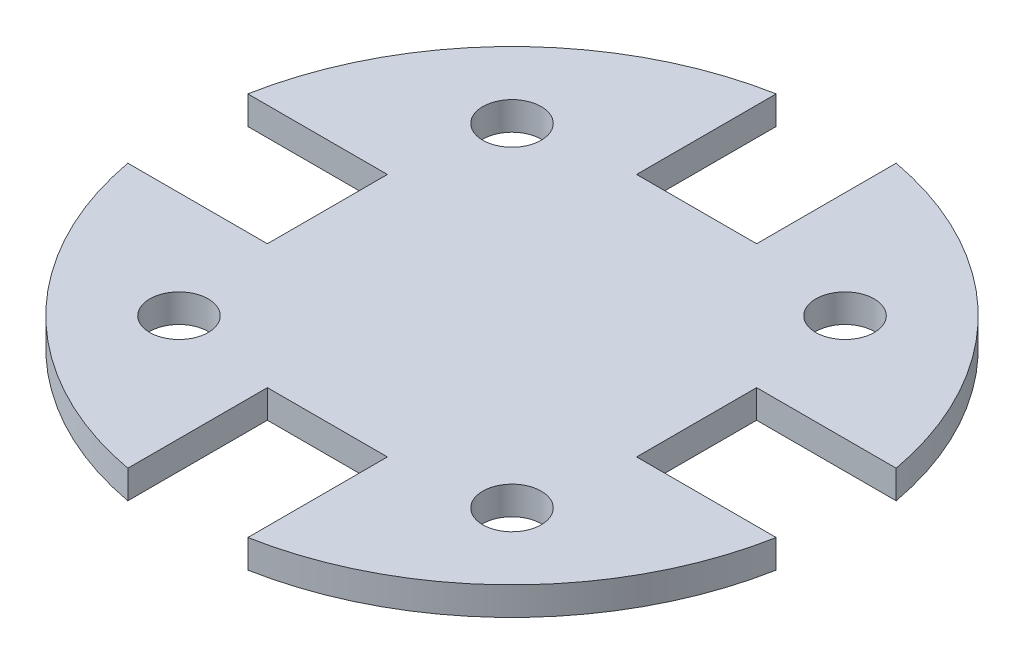
ISO-10303-21;
HEADER;
FILE_DESCRIPTION(('STEP AP214'),'2;1');
FILE_NAME('part.step','',(''),(''),'','','');
FILE_SCHEMA(('AUTOMOTIVE_DESIGN { 1 0 10303 214 1 1 1 1 }'));
ENDSEC;
DATA;
#1=APPLICATION_CONTEXT('core data for automotive mechanical design processes');
#2=APPLICATION_PROTOCOL_DEFINITION('international standard','automotive_design',2000,#1);
#3=PRODUCT_CONTEXT('',#1,'mechanical');
#4=PRODUCT('Part','Part','',(#3));
#5=PRODUCT_RELATED_PRODUCT_CATEGORY('part','',(#4));
#6=PRODUCT_DEFINITION_FORMATION('','',#4);
#7=PRODUCT_DEFINITION_CONTEXT('part definition',#1,'design');
#8=PRODUCT_DEFINITION('design','',#6,#7);
#9=PRODUCT_DEFINITION_SHAPE('','',#8);
#10=(LENGTH_UNIT() NAMED_UNIT(*) SI_UNIT(.MILLI.,.METRE.));
#11=(NAMED_UNIT(*) PLANE_ANGLE_UNIT() SI_UNIT($,.RADIAN.));
#12=(NAMED_UNIT(*) SI_UNIT($,.STERADIAN.) SOLID_ANGLE_UNIT());
#13=UNCERTAINTY_MEASURE_WITH_UNIT(LENGTH_MEASURE(1.E-05),#10,'distance_accuracy_value','');
#14=(GEOMETRIC_REPRESENTATION_CONTEXT(3) GLOBAL_UNCERTAINTY_ASSIGNED_CONTEXT((#13)) GLOBAL_UNIT_ASSIGNED_CONTEXT((#10,
#11,#12)) REPRESENTATION_CONTEXT('',''));
#15=CARTESIAN_POINT('',(0.,0.,0.));
#16=DIRECTION('',(0.,0.,1.));
#17=DIRECTION('',(1.,0.,0.));
#18=AXIS2_PLACEMENT_3D('',#15,#16,#17);
#19=CARTESIAN_POINT('',(0.,5.,0.));
#20=DIRECTION('',(0.,-1.,0.));
#21=DIRECTION('',(0.,0.,-1.));
#22=AXIS2_PLACEMENT_3D('',#19,#20,#21);
#23=CYLINDRICAL_SURFACE('',#22,35.);
#24=DIRECTION('',(0.,-1.,0.));
#25=VECTOR('',#24,1.);
#26=CARTESIAN_POINT('',(-6.37000000000012,5.,-34.4154485660146));
#27=LINE('',#26,#25);
#28=CARTESIAN_POINT('',(-6.37000000000012,5.,-34.4154485660146));
#29=VERTEX_POINT('',#28);
#30=CARTESIAN_POINT('',(-6.37000000000014,2.,-34.4154485660146));
#31=VERTEX_POINT('',#30);
#32=EDGE_CURVE('E167',#29,#31,#27,.T.);
#33=ORIENTED_EDGE('',*,*,#32,.T.);
#34=CARTESIAN_POINT('',(0.,2.,0.));
#35=DIRECTION('',(0.,1.,0.));
#36=DIRECTION('',(0.,0.,1.));
#37=AXIS2_PLACEMENT_3D('',#34,#35,#36);
#38=CIRCLE('',#37,35.);
#39=CARTESIAN_POINT('',(-34.4154485660147,2.,-6.36999999999965));
#40=VERTEX_POINT('',#39);
#41=EDGE_CURVE('E153',#40,#31,#38,.F.);
#42=ORIENTED_EDGE('',*,*,#41,.F.);
#43=DIRECTION('',(0.,-1.,0.));
#44=VECTOR('',#43,1.);
#45=CARTESIAN_POINT('',(-34.4154485660147,5.,-6.36999999999965));
#46=LINE('',#45,#44);
#47=CARTESIAN_POINT('',(-34.4154485660147,5.,-6.36999999999965));
#48=VERTEX_POINT('',#47);
#49=EDGE_CURVE('E164',#40,#48,#46,.F.);
#50=ORIENTED_EDGE('',*,*,#49,.T.);
#51=CARTESIAN_POINT('',(0.,5.,0.));
#52=DIRECTION('',(0.,1.,0.));
#53=DIRECTION('',(0.,0.,1.));
#54=AXIS2_PLACEMENT_3D('',#51,#52,#53);
#55=CIRCLE('',#54,35.);
#56=EDGE_CURVE('E12',#29,#48,#55,.T.);
#57=ORIENTED_EDGE('',*,*,#56,.F.);
#58=EDGE_LOOP('',(#33,#42,#50,#57));
#59=FACE_BOUND('',#58,.T.);
#60=ADVANCED_FACE('F35',(#59),#23,.T.);
#61=DIRECTION('',(0.,-1.,0.));
#62=VECTOR('',#61,1.);
#63=CARTESIAN_POINT('',(-34.4154485660146,5.,6.37000000000024));
#64=LINE('',#63,#62);
#65=CARTESIAN_POINT('',(-34.4154485660146,5.,6.37000000000024));
#66=VERTEX_POINT('',#65);
#67=CARTESIAN_POINT('',(-34.4154485660146,2.,6.37000000000024));
#68=VERTEX_POINT('',#67);
#69=EDGE_CURVE('E174',#66,#68,#64,.T.);
#70=ORIENTED_EDGE('',*,*,#69,.T.);
#71=CARTESIAN_POINT('',(0.,2.,0.));
#72=DIRECTION('',(0.,1.,0.));
#73=DIRECTION('',(0.,0.,1.));
#74=AXIS2_PLACEMENT_3D('',#71,#72,#73);
#75=CIRCLE('',#74,35.);
#76=CARTESIAN_POINT('',(-6.36999999999977,2.,34.4154485660147));
#77=VERTEX_POINT('',#76);
#78=EDGE_CURVE('E51',#77,#68,#75,.F.);
#79=ORIENTED_EDGE('',*,*,#78,.F.);
#80=DIRECTION('',(0.,-1.,0.));
#81=VECTOR('',#80,1.);
#82=CARTESIAN_POINT('',(-6.36999999999977,5.,34.4154485660147));
#83=LINE('',#82,#81);
#84=CARTESIAN_POINT('',(-6.36999999999977,5.,34.4154485660147));
#85=VERTEX_POINT('',#84);
#86=EDGE_CURVE('E177',#77,#85,#83,.F.);
#87=ORIENTED_EDGE('',*,*,#86,.T.);
#88=EDGE_CURVE('E43',#66,#85,#55,.T.);
#89=ORIENTED_EDGE('',*,*,#88,.F.);
#90=EDGE_LOOP('',(#70,#79,#87,#89));
#91=FACE_BOUND('',#90,.T.);
#92=ADVANCED_FACE('F269',(#91),#23,.T.);
#93=DIRECTION('',(0.,-1.,0.));
#94=VECTOR('',#93,1.);
#95=CARTESIAN_POINT('',(6.37000000000012,5.,34.4154485660146));
#96=LINE('',#95,#94);
#97=CARTESIAN_POINT('',(6.37000000000012,5.,34.4154485660146));
#98=VERTEX_POINT('',#97);
#99=CARTESIAN_POINT('',(6.37000000000012,2.,34.4154485660146));
#100=VERTEX_POINT('',#99);
#101=EDGE_CURVE('E173',#98,#100,#96,.T.);
#102=ORIENTED_EDGE('',*,*,#101,.T.);
#103=CARTESIAN_POINT('',(0.,2.,0.));
#104=DIRECTION('',(0.,1.,0.));
#105=DIRECTION('',(0.,0.,1.));
#106=AXIS2_PLACEMENT_3D('',#103,#104,#105);
#107=CIRCLE('',#106,35.);
#108=CARTESIAN_POINT('',(34.4154485660148,2.,6.36999999999941));
#109=VERTEX_POINT('',#108);
#110=EDGE_CURVE('E289',#109,#100,#107,.F.);
#111=ORIENTED_EDGE('',*,*,#110,.F.);
#112=DIRECTION('',(0.,-1.,0.));
#113=VECTOR('',#112,1.);
#114=CARTESIAN_POINT('',(34.4154485660148,5.,6.36999999999941));
#115=LINE('',#114,#113);
#116=CARTESIAN_POINT('',(34.4154485660148,5.,6.36999999999941));
#117=VERTEX_POINT('',#116);
#118=EDGE_CURVE('E188',#109,#117,#115,.F.);
#119=ORIENTED_EDGE('',*,*,#118,.T.);
#120=EDGE_CURVE('E253',#98,#117,#55,.T.);
#121=ORIENTED_EDGE('',*,*,#120,.F.);
#122=EDGE_LOOP('',(#102,#111,#119,#121));
#123=FACE_BOUND('',#122,.T.);
#124=ADVANCED_FACE('F287',(#123),#23,.T.);
#125=DIRECTION('',(0.,-1.,0.));
#126=VECTOR('',#125,1.);
#127=CARTESIAN_POINT('',(34.4154485660146,5.,-6.37000000000048));
#128=LINE('',#127,#126);
#129=CARTESIAN_POINT('',(34.4154485660146,5.,-6.37000000000048));
#130=VERTEX_POINT('',#129);
#131=CARTESIAN_POINT('',(34.4154485660146,2.,-6.37000000000048));
#132=VERTEX_POINT('',#131);
#133=EDGE_CURVE('E185',#130,#132,#128,.T.);
#134=ORIENTED_EDGE('',*,*,#133,.T.);
#135=CARTESIAN_POINT('',(0.,2.,0.));
#136=DIRECTION('',(0.,1.,0.));
#137=DIRECTION('',(0.,0.,1.));
#138=AXIS2_PLACEMENT_3D('',#135,#136,#137);
#139=CIRCLE('',#138,35.);
#140=CARTESIAN_POINT('',(6.36999999999977,2.,-34.4154485660147));
#141=VERTEX_POINT('',#140);
#142=EDGE_CURVE('E308',#141,#132,#139,.F.);
#143=ORIENTED_EDGE('',*,*,#142,.F.);
#144=DIRECTION('',(0.,-1.,0.));
#145=VECTOR('',#144,1.);
#146=CARTESIAN_POINT('',(6.36999999999977,5.,-34.4154485660147));
#147=LINE('',#146,#145);
#148=CARTESIAN_POINT('',(6.36999999999977,5.,-34.4154485660147));
#149=VERTEX_POINT('',#148);
#150=EDGE_CURVE('E191',#141,#149,#147,.F.);
#151=ORIENTED_EDGE('',*,*,#150,.T.);
#152=EDGE_CURVE('E44',#130,#149,#55,.T.);
#153=ORIENTED_EDGE('',*,*,#152,.F.);
#154=EDGE_LOOP('',(#134,#143,#151,#153));
#155=FACE_BOUND('',#154,.T.);
#156=ADVANCED_FACE('F37',(#155),#23,.T.);
#157=CARTESIAN_POINT('',(0.,5.,0.));
#158=DIRECTION('',(0.,1.,0.));
#159=DIRECTION('',(0.,0.,1.));
#160=AXIS2_PLACEMENT_3D('',#157,#158,#159);
#161=PLANE('',#160);
#162=ORIENTED_EDGE('',*,*,#56,.T.);
#163=DIRECTION('',(-1.,0.,0.));
#164=VECTOR('',#163,1.);
#165=CARTESIAN_POINT('',(-19.6,5.,-6.3699999999997));
#166=LINE('',#165,#164);
#167=CARTESIAN_POINT('',(-19.6,5.,-6.3699999999997));
#168=VERTEX_POINT('',#167);
#169=EDGE_CURVE('E172',#168,#48,#166,.T.);
#170=ORIENTED_EDGE('',*,*,#169,.F.);
#171=DIRECTION('',(0.,0.,-1.));
#172=VECTOR('',#171,1.);
#173=CARTESIAN_POINT('',(-19.5999999999999,5.,6.37000000000019));
#174=LINE('',#173,#172);
#175=CARTESIAN_POINT('',(-19.5999999999999,5.,6.37000000000019));
#176=VERTEX_POINT('',#175);
#177=EDGE_CURVE('E199',#176,#168,#174,.T.);
#178=ORIENTED_EDGE('',*,*,#177,.F.);
#179=DIRECTION('',(1.,0.,0.));
#180=VECTOR('',#179,1.);
#181=CARTESIAN_POINT('',(-19.5999999999999,5.,6.37000000000019));
#182=LINE('',#181,#180);
#183=EDGE_CURVE('E195',#66,#176,#182,.T.);
#184=ORIENTED_EDGE('',*,*,#183,.F.);
#185=ORIENTED_EDGE('',*,*,#88,.T.);
#186=DIRECTION('',(0.,0.,1.));
#187=VECTOR('',#186,1.);
#188=CARTESIAN_POINT('',(-6.36999999999977,5.,19.5999999999999));
#189=LINE('',#188,#187);
#190=CARTESIAN_POINT('',(-6.36999999999977,5.,19.5999999999999));
#191=VERTEX_POINT('',#190);
#192=EDGE_CURVE('E207',#191,#85,#189,.T.);
#193=ORIENTED_EDGE('',*,*,#192,.F.);
#194=DIRECTION('',(-1.,0.,0.));
#195=VECTOR('',#194,1.);
#196=CARTESIAN_POINT('',(6.37000000000012,5.,19.5999999999999));
#197=LINE('',#196,#195);
#198=CARTESIAN_POINT('',(6.37000000000012,5.,19.5999999999999));
#199=VERTEX_POINT('',#198);
#200=EDGE_CURVE('E214',#199,#191,#197,.T.);
#201=ORIENTED_EDGE('',*,*,#200,.F.);
#202=DIRECTION('',(0.,0.,-1.));
#203=VECTOR('',#202,1.);
#204=CARTESIAN_POINT('',(6.37000000000012,5.,19.5999999999999));
#205=LINE('',#204,#203);
#206=EDGE_CURVE('E210',#98,#199,#205,.T.);
#207=ORIENTED_EDGE('',*,*,#206,.F.);
#208=ORIENTED_EDGE('',*,*,#120,.T.);
#209=DIRECTION('',(1.,0.,0.));
#210=VECTOR('',#209,1.);
#211=CARTESIAN_POINT('',(19.6,5.,6.36999999999956));
#212=LINE('',#211,#210);
#213=CARTESIAN_POINT('',(19.6,5.,6.36999999999956));
#214=VERTEX_POINT('',#213);
#215=EDGE_CURVE('E193',#214,#117,#212,.T.);
#216=ORIENTED_EDGE('',*,*,#215,.F.);
#217=DIRECTION('',(0.,0.,1.));
#218=VECTOR('',#217,1.);
#219=CARTESIAN_POINT('',(19.5999999999999,5.,-6.37000000000033));
#220=LINE('',#219,#218);
#221=CARTESIAN_POINT('',(19.5999999999999,5.,-6.37000000000033));
#222=VERTEX_POINT('',#221);
#223=EDGE_CURVE('E225',#222,#214,#220,.T.);
#224=ORIENTED_EDGE('',*,*,#223,.F.);
#225=DIRECTION('',(-1.,0.,0.));
#226=VECTOR('',#225,1.);
#227=CARTESIAN_POINT('',(19.5999999999999,5.,-6.37000000000033));
#228=LINE('',#227,#226);
#229=EDGE_CURVE('E222',#130,#222,#228,.T.);
#230=ORIENTED_EDGE('',*,*,#229,.F.);
#231=ORIENTED_EDGE('',*,*,#152,.T.);
#232=DIRECTION('',(0.,0.,-1.));
#233=VECTOR('',#232,1.);
#234=CARTESIAN_POINT('',(6.36999999999977,5.,-19.5999999999999));
#235=LINE('',#234,#233);
#236=CARTESIAN_POINT('',(6.36999999999977,5.,-19.5999999999999));
#237=VERTEX_POINT('',#236);
#238=EDGE_CURVE('E205',#237,#149,#235,.T.);
#239=ORIENTED_EDGE('',*,*,#238,.F.);
#240=DIRECTION('',(1.,0.,0.));
#241=VECTOR('',#240,1.);
#242=CARTESIAN_POINT('',(-6.37000000000012,5.,-19.5999999999999));
#243=LINE('',#242,#241);
#244=CARTESIAN_POINT('',(-6.37000000000012,5.,-19.5999999999999));
#245=VERTEX_POINT('',#244);
#246=EDGE_CURVE('E235',#245,#237,#243,.T.);
#247=ORIENTED_EDGE('',*,*,#246,.F.);
#248=DIRECTION('',(0.,0.,1.));
#249=VECTOR('',#248,1.);
#250=CARTESIAN_POINT('',(-6.37000000000012,5.,-19.5999999999999));
#251=LINE('',#250,#249);
#252=EDGE_CURVE('E232',#29,#245,#251,.T.);
#253=ORIENTED_EDGE('',*,*,#252,.F.);
#254=EDGE_LOOP('',(#162,#170,#178,#184,#185,#193,#201,#207,#208,#216,#224,#230,#231,#239,#247,#253));
#255=FACE_BOUND('',#254,.T.);
#256=CARTESIAN_POINT('',(-17.6776695296637,5.,17.6776695296638));
#257=DIRECTION('',(0.,1.,0.));
#258=DIRECTION('',(0.,0.,1.));
#259=AXIS2_PLACEMENT_3D('',#256,#257,#258);
#260=CIRCLE('',#259,3.1);
#261=CARTESIAN_POINT('',(-17.6776695296637,5.,20.7776695296638));
#262=VERTEX_POINT('',#261);
#263=EDGE_CURVE('E239',#262,#262,#260,.T.);
#264=ORIENTED_EDGE('',*,*,#263,.F.);
#265=EDGE_LOOP('',(#264));
#266=FACE_BOUND('',#265,.T.);
#267=CARTESIAN_POINT('',(17.6776695296637,5.,17.6776695296638));
#268=DIRECTION('',(0.,1.,0.));
#269=DIRECTION('',(0.,0.,1.));
#270=AXIS2_PLACEMENT_3D('',#267,#268,#269);
#271=CIRCLE('',#270,3.1);
#272=CARTESIAN_POINT('',(17.6776695296637,5.,20.7776695296638));
#273=VERTEX_POINT('',#272);
#274=EDGE_CURVE('E245',#273,#273,#271,.T.);
#275=ORIENTED_EDGE('',*,*,#274,.F.);
#276=EDGE_LOOP('',(#275));
#277=FACE_BOUND('',#276,.T.);
#278=CARTESIAN_POINT('',(17.6776695296637,5.,-17.6776695296636));
#279=DIRECTION('',(0.,1.,0.));
#280=DIRECTION('',(0.,0.,1.));
#281=AXIS2_PLACEMENT_3D('',#278,#279,#280);
#282=CIRCLE('',#281,3.1);
#283=CARTESIAN_POINT('',(17.6776695296637,5.,-14.5776695296636));
#284=VERTEX_POINT('',#283);
#285=EDGE_CURVE('E241',#284,#284,#282,.T.);
#286=ORIENTED_EDGE('',*,*,#285,.F.);
#287=EDGE_LOOP('',(#286));
#288=FACE_BOUND('',#287,.T.);
#289=CARTESIAN_POINT('',(-17.6776695296637,5.,-17.6776695296636));
#290=DIRECTION('',(0.,1.,0.));
#291=DIRECTION('',(0.,0.,1.));
#292=AXIS2_PLACEMENT_3D('',#289,#290,#291);
#293=CIRCLE('',#292,3.1);
#294=CARTESIAN_POINT('',(-17.6776695296637,5.,-14.5776695296636));
#295=VERTEX_POINT('',#294);
#296=EDGE_CURVE('E244',#295,#295,#293,.T.);
#297=ORIENTED_EDGE('',*,*,#296,.F.);
#298=EDGE_LOOP('',(#297));
#299=FACE_BOUND('',#298,.T.);
#300=ADVANCED_FACE('F263',(#255,#266,#277,#288,#299),#161,.T.);
#301=CARTESIAN_POINT('',(-17.6776695296637,0.,-17.6776695296636));
#302=DIRECTION('',(0.,1.,0.));
#303=DIRECTION('',(0.,0.,1.));
#304=AXIS2_PLACEMENT_3D('',#301,#302,#303);
#305=CYLINDRICAL_SURFACE('',#304,3.1);
#306=CARTESIAN_POINT('',(-17.6776695296637,2.,-17.6776695296636));
#307=DIRECTION('',(0.,1.,0.));
#308=DIRECTION('',(0.,0.,1.));
#309=AXIS2_PLACEMENT_3D('',#306,#307,#308);
#310=CIRCLE('',#309,3.1);
#311=CARTESIAN_POINT('',(-17.6776695296637,2.,-14.5776695296636));
#312=VERTEX_POINT('',#311);
#313=EDGE_CURVE('E180',#312,#312,#310,.F.);
#314=ORIENTED_EDGE('',*,*,#313,.T.);
#315=EDGE_LOOP('',(#314));
#316=FACE_BOUND('',#315,.T.);
#317=ORIENTED_EDGE('',*,*,#296,.T.);
#318=EDGE_LOOP('',(#317));
#319=FACE_BOUND('',#318,.T.);
#320=ADVANCED_FACE('F353',(#316,#319),#305,.F.);
#321=CARTESIAN_POINT('',(17.6776695296637,0.,-17.6776695296636));
#322=DIRECTION('',(0.,1.,0.));
#323=DIRECTION('',(0.,0.,1.));
#324=AXIS2_PLACEMENT_3D('',#321,#322,#323);
#325=CYLINDRICAL_SURFACE('',#324,3.1);
#326=CARTESIAN_POINT('',(17.6776695296637,2.,-17.6776695296636));
#327=DIRECTION('',(0.,1.,0.));
#328=DIRECTION('',(0.,0.,1.));
#329=AXIS2_PLACEMENT_3D('',#326,#327,#328);
#330=CIRCLE('',#329,3.1);
#331=CARTESIAN_POINT('',(17.6776695296637,2.,-14.5776695296636));
#332=VERTEX_POINT('',#331);
#333=EDGE_CURVE('E348',#332,#332,#330,.F.);
#334=ORIENTED_EDGE('',*,*,#333,.T.);
#335=EDGE_LOOP('',(#334));
#336=FACE_BOUND('',#335,.T.);
#337=ORIENTED_EDGE('',*,*,#285,.T.);
#338=EDGE_LOOP('',(#337));
#339=FACE_BOUND('',#338,.T.);
#340=ADVANCED_FACE('F401',(#336,#339),#325,.F.);
#341=CARTESIAN_POINT('',(17.6776695296637,0.,17.6776695296638));
#342=DIRECTION('',(0.,1.,0.));
#343=DIRECTION('',(0.,0.,1.));
#344=AXIS2_PLACEMENT_3D('',#341,#342,#343);
#345=CYLINDRICAL_SURFACE('',#344,3.1);
#346=CARTESIAN_POINT('',(17.6776695296637,2.,17.6776695296638));
#347=DIRECTION('',(0.,1.,0.));
#348=DIRECTION('',(0.,0.,1.));
#349=AXIS2_PLACEMENT_3D('',#346,#347,#348);
#350=CIRCLE('',#349,3.1);
#351=CARTESIAN_POINT('',(17.6776695296637,2.,20.7776695296638));
#352=VERTEX_POINT('',#351);
#353=EDGE_CURVE('E345',#352,#352,#350,.F.);
#354=ORIENTED_EDGE('',*,*,#353,.T.);
#355=EDGE_LOOP('',(#354));
#356=FACE_BOUND('',#355,.T.);
#357=ORIENTED_EDGE('',*,*,#274,.T.);
#358=EDGE_LOOP('',(#357));
#359=FACE_BOUND('',#358,.T.);
#360=ADVANCED_FACE('F407',(#356,#359),#345,.F.);
#361=CARTESIAN_POINT('',(-17.6776695296637,0.,17.6776695296638));
#362=DIRECTION('',(0.,1.,0.));
#363=DIRECTION('',(0.,0.,1.));
#364=AXIS2_PLACEMENT_3D('',#361,#362,#363);
#365=CYLINDRICAL_SURFACE('',#364,3.1);
#366=CARTESIAN_POINT('',(-17.6776695296637,2.,17.6776695296638));
#367=DIRECTION('',(0.,1.,0.));
#368=DIRECTION('',(0.,0.,1.));
#369=AXIS2_PLACEMENT_3D('',#366,#367,#368);
#370=CIRCLE('',#369,3.1);
#371=CARTESIAN_POINT('',(-17.6776695296637,2.,20.7776695296638));
#372=VERTEX_POINT('',#371);
#373=EDGE_CURVE('E326',#372,#372,#370,.F.);
#374=ORIENTED_EDGE('',*,*,#373,.T.);
#375=EDGE_LOOP('',(#374));
#376=FACE_BOUND('',#375,.T.);
#377=ORIENTED_EDGE('',*,*,#263,.T.);
#378=EDGE_LOOP('',(#377));
#379=FACE_BOUND('',#378,.T.);
#380=ADVANCED_FACE('F415',(#376,#379),#365,.F.);
#381=CARTESIAN_POINT('',(6.36999999999977,1.15359111152458E-13,-19.5999999999999));
#382=DIRECTION('',(1.,0.,0.));
#383=DIRECTION('',(0.,0.,-1.));
#384=AXIS2_PLACEMENT_3D('',#381,#382,#383);
#385=PLANE('',#384);
#386=ORIENTED_EDGE('',*,*,#150,.F.);
#387=DIRECTION('',(0.,0.,-1.));
#388=VECTOR('',#387,1.);
#389=CARTESIAN_POINT('',(6.36999999999977,2.,-19.5999999999999));
#390=LINE('',#389,#388);
#391=CARTESIAN_POINT('',(6.36999999999977,2.,-19.5999999999999));
#392=VERTEX_POINT('',#391);
#393=EDGE_CURVE('E310',#392,#141,#390,.T.);
#394=ORIENTED_EDGE('',*,*,#393,.F.);
#395=DIRECTION('',(0.,1.,0.));
#396=VECTOR('',#395,1.);
#397=CARTESIAN_POINT('',(6.36999999999977,1.15359111152458E-13,-19.5999999999999));
#398=LINE('',#397,#396);
#399=EDGE_CURVE('E59',#392,#237,#398,.T.);
#400=ORIENTED_EDGE('',*,*,#399,.T.);
#401=ORIENTED_EDGE('',*,*,#238,.T.);
#402=EDGE_LOOP('',(#386,#394,#400,#401));
#403=FACE_BOUND('',#402,.T.);
#404=ADVANCED_FACE('F309',(#403),#385,.F.);
#405=CARTESIAN_POINT('',(-6.37000000000012,1.15359111152458E-13,-19.5999999999999));
#406=DIRECTION('',(0.,0.,1.));
#407=DIRECTION('',(1.,0.,0.));
#408=AXIS2_PLACEMENT_3D('',#405,#406,#407);
#409=PLANE('',#408);
#410=ORIENTED_EDGE('',*,*,#399,.F.);
#411=DIRECTION('',(1.,0.,0.));
#412=VECTOR('',#411,1.);
#413=CARTESIAN_POINT('',(-6.37000000000012,2.,-19.5999999999999));
#414=LINE('',#413,#412);
#415=CARTESIAN_POINT('',(-6.37000000000012,2.,-19.5999999999999));
#416=VERTEX_POINT('',#415);
#417=EDGE_CURVE('E316',#416,#392,#414,.T.);
#418=ORIENTED_EDGE('',*,*,#417,.F.);
#419=DIRECTION('',(0.,1.,0.));
#420=VECTOR('',#419,1.);
#421=CARTESIAN_POINT('',(-6.37000000000012,1.15359111152458E-13,-19.5999999999999));
#422=LINE('',#421,#420);
#423=EDGE_CURVE('E237',#416,#245,#422,.T.);
#424=ORIENTED_EDGE('',*,*,#423,.T.);
#425=ORIENTED_EDGE('',*,*,#246,.T.);
#426=EDGE_LOOP('',(#410,#418,#424,#425));
#427=FACE_BOUND('',#426,.T.);
#428=ADVANCED_FACE('F313',(#427),#409,.F.);
#429=CARTESIAN_POINT('',(-6.37000000000012,1.15359111152458E-13,-19.5999999999999));
#430=DIRECTION('',(-1.,0.,0.));
#431=DIRECTION('',(0.,0.,1.));
#432=AXIS2_PLACEMENT_3D('',#429,#430,#431);
#433=PLANE('',#432);
#434=ORIENTED_EDGE('',*,*,#423,.F.);
#435=DIRECTION('',(0.,0.,1.));
#436=VECTOR('',#435,1.);
#437=CARTESIAN_POINT('',(-6.37000000000014,2.,-34.4154485660146));
#438=LINE('',#437,#436);
#439=EDGE_CURVE('E168',#31,#416,#438,.T.);
#440=ORIENTED_EDGE('',*,*,#439,.F.);
#441=ORIENTED_EDGE('',*,*,#32,.F.);
#442=ORIENTED_EDGE('',*,*,#252,.T.);
#443=EDGE_LOOP('',(#434,#440,#441,#442));
#444=FACE_BOUND('',#443,.T.);
#445=ADVANCED_FACE('F318',(#444),#433,.F.);
#446=CARTESIAN_POINT('',(19.6,1.15359111152458E-13,6.36999999999956));
#447=DIRECTION('',(0.,0.,1.));
#448=DIRECTION('',(1.,0.,0.));
#449=AXIS2_PLACEMENT_3D('',#446,#447,#448);
#450=PLANE('',#449);
#451=ORIENTED_EDGE('',*,*,#118,.F.);
#452=DIRECTION('',(1.,0.,0.));
#453=VECTOR('',#452,1.);
#454=CARTESIAN_POINT('',(19.6,2.,6.36999999999956));
#455=LINE('',#454,#453);
#456=CARTESIAN_POINT('',(19.6,2.,6.36999999999956));
#457=VERTEX_POINT('',#456);
#458=EDGE_CURVE('E335',#457,#109,#455,.T.);
#459=ORIENTED_EDGE('',*,*,#458,.F.);
#460=DIRECTION('',(0.,1.,0.));
#461=VECTOR('',#460,1.);
#462=CARTESIAN_POINT('',(19.6,1.15359111152458E-13,6.36999999999956));
#463=LINE('',#462,#461);
#464=EDGE_CURVE('E211',#457,#214,#463,.T.);
#465=ORIENTED_EDGE('',*,*,#464,.T.);
#466=ORIENTED_EDGE('',*,*,#215,.T.);
#467=EDGE_LOOP('',(#451,#459,#465,#466));
#468=FACE_BOUND('',#467,.T.);
#469=ADVANCED_FACE('F292',(#468),#450,.F.);
#470=CARTESIAN_POINT('',(19.5999999999999,1.15359111152458E-13,-6.37000000000033));
#471=DIRECTION('',(-1.,0.,0.));
#472=DIRECTION('',(0.,0.,1.));
#473=AXIS2_PLACEMENT_3D('',#470,#471,#472);
#474=PLANE('',#473);
#475=ORIENTED_EDGE('',*,*,#464,.F.);
#476=DIRECTION('',(0.,0.,1.));
#477=VECTOR('',#476,1.);
#478=CARTESIAN_POINT('',(19.5999999999999,2.,-6.37000000000033));
#479=LINE('',#478,#477);
#480=CARTESIAN_POINT('',(19.5999999999999,2.,-6.37000000000033));
#481=VERTEX_POINT('',#480);
#482=EDGE_CURVE('E300',#481,#457,#479,.T.);
#483=ORIENTED_EDGE('',*,*,#482,.F.);
#484=DIRECTION('',(0.,1.,0.));
#485=VECTOR('',#484,1.);
#486=CARTESIAN_POINT('',(19.5999999999999,1.15359111152458E-13,-6.37000000000033));
#487=LINE('',#486,#485);
#488=EDGE_CURVE('E228',#481,#222,#487,.T.);
#489=ORIENTED_EDGE('',*,*,#488,.T.);
#490=ORIENTED_EDGE('',*,*,#223,.T.);
#491=EDGE_LOOP('',(#475,#483,#489,#490));
#492=FACE_BOUND('',#491,.T.);
#493=ADVANCED_FACE('F297',(#492),#474,.F.);
#494=CARTESIAN_POINT('',(19.5999999999999,1.15359111152458E-13,-6.37000000000033));
#495=DIRECTION('',(0.,0.,-1.));
#496=DIRECTION('',(-1.,0.,0.));
#497=AXIS2_PLACEMENT_3D('',#494,#495,#496);
#498=PLANE('',#497);
#499=ORIENTED_EDGE('',*,*,#488,.F.);
#500=DIRECTION('',(-1.,0.,0.));
#501=VECTOR('',#500,1.);
#502=CARTESIAN_POINT('',(34.4154485660146,2.,-6.37000000000048));
#503=LINE('',#502,#501);
#504=EDGE_CURVE('E304',#132,#481,#503,.T.);
#505=ORIENTED_EDGE('',*,*,#504,.F.);
#506=ORIENTED_EDGE('',*,*,#133,.F.);
#507=ORIENTED_EDGE('',*,*,#229,.T.);
#508=EDGE_LOOP('',(#499,#505,#506,#507));
#509=FACE_BOUND('',#508,.T.);
#510=ADVANCED_FACE('F303',(#509),#498,.F.);
#511=CARTESIAN_POINT('',(-6.36999999999977,1.15359111152458E-13,19.5999999999999));
#512=DIRECTION('',(-1.,0.,0.));
#513=DIRECTION('',(0.,0.,1.));
#514=AXIS2_PLACEMENT_3D('',#511,#512,#513);
#515=PLANE('',#514);
#516=ORIENTED_EDGE('',*,*,#86,.F.);
#517=DIRECTION('',(0.,0.,1.));
#518=VECTOR('',#517,1.);
#519=CARTESIAN_POINT('',(-6.36999999999977,2.,19.5999999999999));
#520=LINE('',#519,#518);
#521=CARTESIAN_POINT('',(-6.36999999999977,2.,19.5999999999999));
#522=VERTEX_POINT('',#521);
#523=EDGE_CURVE('E275',#522,#77,#520,.T.);
#524=ORIENTED_EDGE('',*,*,#523,.F.);
#525=DIRECTION('',(0.,1.,0.));
#526=VECTOR('',#525,1.);
#527=CARTESIAN_POINT('',(-6.36999999999977,1.15359111152458E-13,19.5999999999999));
#528=LINE('',#527,#526);
#529=EDGE_CURVE('E196',#522,#191,#528,.T.);
#530=ORIENTED_EDGE('',*,*,#529,.T.);
#531=ORIENTED_EDGE('',*,*,#192,.T.);
#532=EDGE_LOOP('',(#516,#524,#530,#531));
#533=FACE_BOUND('',#532,.T.);
#534=ADVANCED_FACE('F273',(#533),#515,.F.);
#535=CARTESIAN_POINT('',(6.37000000000012,1.15359111152458E-13,19.5999999999999));
#536=DIRECTION('',(0.,0.,-1.));
#537=DIRECTION('',(-1.,0.,0.));
#538=AXIS2_PLACEMENT_3D('',#535,#536,#537);
#539=PLANE('',#538);
#540=ORIENTED_EDGE('',*,*,#529,.F.);
#541=DIRECTION('',(-1.,0.,0.));
#542=VECTOR('',#541,1.);
#543=CARTESIAN_POINT('',(6.37000000000012,2.,19.5999999999999));
#544=LINE('',#543,#542);
#545=CARTESIAN_POINT('',(6.37000000000012,2.,19.5999999999999));
#546=VERTEX_POINT('',#545);
#547=EDGE_CURVE('E331',#546,#522,#544,.T.);
#548=ORIENTED_EDGE('',*,*,#547,.F.);
#549=DIRECTION('',(0.,1.,0.));
#550=VECTOR('',#549,1.);
#551=CARTESIAN_POINT('',(6.37000000000012,1.15359111152458E-13,19.5999999999999));
#552=LINE('',#551,#550);
#553=EDGE_CURVE('E217',#546,#199,#552,.T.);
#554=ORIENTED_EDGE('',*,*,#553,.T.);
#555=ORIENTED_EDGE('',*,*,#200,.T.);
#556=EDGE_LOOP('',(#540,#548,#554,#555));
#557=FACE_BOUND('',#556,.T.);
#558=ADVANCED_FACE('F278',(#557),#539,.F.);
#559=CARTESIAN_POINT('',(6.37000000000012,1.15359111152458E-13,19.5999999999999));
#560=DIRECTION('',(1.,0.,0.));
#561=DIRECTION('',(0.,0.,-1.));
#562=AXIS2_PLACEMENT_3D('',#559,#560,#561);
#563=PLANE('',#562);
#564=ORIENTED_EDGE('',*,*,#553,.F.);
#565=DIRECTION('',(0.,0.,-1.));
#566=VECTOR('',#565,1.);
#567=CARTESIAN_POINT('',(6.37000000000012,2.,34.4154485660146));
#568=LINE('',#567,#566);
#569=EDGE_CURVE('E284',#100,#546,#568,.T.);
#570=ORIENTED_EDGE('',*,*,#569,.F.);
#571=ORIENTED_EDGE('',*,*,#101,.F.);
#572=ORIENTED_EDGE('',*,*,#206,.T.);
#573=EDGE_LOOP('',(#564,#570,#571,#572));
#574=FACE_BOUND('',#573,.T.);
#575=ADVANCED_FACE('F283',(#574),#563,.F.);
#576=CARTESIAN_POINT('',(-19.6,1.15359111152458E-13,-6.3699999999997));
#577=DIRECTION('',(0.,0.,-1.));
#578=DIRECTION('',(-1.,0.,0.));
#579=AXIS2_PLACEMENT_3D('',#576,#577,#578);
#580=PLANE('',#579);
#581=ORIENTED_EDGE('',*,*,#49,.F.);
#582=DIRECTION('',(-1.,0.,0.));
#583=VECTOR('',#582,1.);
#584=CARTESIAN_POINT('',(-19.6,2.,-6.3699999999997));
#585=LINE('',#584,#583);
#586=CARTESIAN_POINT('',(-19.6,2.,-6.3699999999997));
#587=VERTEX_POINT('',#586);
#588=EDGE_CURVE('E149',#587,#40,#585,.T.);
#589=ORIENTED_EDGE('',*,*,#588,.F.);
#590=DIRECTION('',(0.,1.,0.));
#591=VECTOR('',#590,1.);
#592=CARTESIAN_POINT('',(-19.6,1.15359111152458E-13,-6.3699999999997));
#593=LINE('',#592,#591);
#594=EDGE_CURVE('E203',#587,#168,#593,.T.);
#595=ORIENTED_EDGE('',*,*,#594,.T.);
#596=ORIENTED_EDGE('',*,*,#169,.T.);
#597=EDGE_LOOP('',(#581,#589,#595,#596));
#598=FACE_BOUND('',#597,.T.);
#599=ADVANCED_FACE('F170',(#598),#580,.F.);
#600=CARTESIAN_POINT('',(-19.5999999999999,1.15359111152458E-13,6.37000000000019));
#601=DIRECTION('',(1.,0.,0.));
#602=DIRECTION('',(0.,0.,-1.));
#603=AXIS2_PLACEMENT_3D('',#600,#601,#602);
#604=PLANE('',#603);
#605=ORIENTED_EDGE('',*,*,#594,.F.);
#606=DIRECTION('',(0.,0.,-1.));
#607=VECTOR('',#606,1.);
#608=CARTESIAN_POINT('',(-19.5999999999999,2.,6.37000000000019));
#609=LINE('',#608,#607);
#610=CARTESIAN_POINT('',(-19.5999999999999,2.,6.37000000000019));
#611=VERTEX_POINT('',#610);
#612=EDGE_CURVE('E156',#611,#587,#609,.T.);
#613=ORIENTED_EDGE('',*,*,#612,.F.);
#614=DIRECTION('',(0.,1.,0.));
#615=VECTOR('',#614,1.);
#616=CARTESIAN_POINT('',(-19.5999999999999,1.15359111152458E-13,6.37000000000019));
#617=LINE('',#616,#615);
#618=EDGE_CURVE('E202',#611,#176,#617,.T.);
#619=ORIENTED_EDGE('',*,*,#618,.T.);
#620=ORIENTED_EDGE('',*,*,#177,.T.);
#621=EDGE_LOOP('',(#605,#613,#619,#620));
#622=FACE_BOUND('',#621,.T.);
#623=ADVANCED_FACE('F320',(#622),#604,.F.);
#624=CARTESIAN_POINT('',(-19.5999999999999,1.15359111152458E-13,6.37000000000019));
#625=DIRECTION('',(0.,0.,1.));
#626=DIRECTION('',(1.,0.,0.));
#627=AXIS2_PLACEMENT_3D('',#624,#625,#626);
#628=PLANE('',#627);
#629=ORIENTED_EDGE('',*,*,#618,.F.);
#630=DIRECTION('',(1.,0.,0.));
#631=VECTOR('',#630,1.);
#632=CARTESIAN_POINT('',(-34.4154485660146,2.,6.37000000000025));
#633=LINE('',#632,#631);
#634=EDGE_CURVE('E324',#68,#611,#633,.T.);
#635=ORIENTED_EDGE('',*,*,#634,.F.);
#636=ORIENTED_EDGE('',*,*,#69,.F.);
#637=ORIENTED_EDGE('',*,*,#183,.T.);
#638=EDGE_LOOP('',(#629,#635,#636,#637));
#639=FACE_BOUND('',#638,.T.);
#640=ADVANCED_FACE('F323',(#639),#628,.F.);
#641=CARTESIAN_POINT('',(0.,2.,0.));
#642=DIRECTION('',(0.,1.,0.));
#643=DIRECTION('',(0.,0.,1.));
#644=AXIS2_PLACEMENT_3D('',#641,#642,#643);
#645=PLANE('',#644);
#646=ORIENTED_EDGE('',*,*,#333,.F.);
#647=EDGE_LOOP('',(#646));
#648=FACE_BOUND('',#647,.T.);
#649=ORIENTED_EDGE('',*,*,#373,.F.);
#650=EDGE_LOOP('',(#649));
#651=FACE_BOUND('',#650,.T.);
#652=ORIENTED_EDGE('',*,*,#612,.T.);
#653=ORIENTED_EDGE('',*,*,#588,.T.);
#654=ORIENTED_EDGE('',*,*,#41,.T.);
#655=ORIENTED_EDGE('',*,*,#439,.T.);
#656=ORIENTED_EDGE('',*,*,#417,.T.);
#657=ORIENTED_EDGE('',*,*,#393,.T.);
#658=ORIENTED_EDGE('',*,*,#142,.T.);
#659=ORIENTED_EDGE('',*,*,#504,.T.);
#660=ORIENTED_EDGE('',*,*,#482,.T.);
#661=ORIENTED_EDGE('',*,*,#458,.T.);
#662=ORIENTED_EDGE('',*,*,#110,.T.);
#663=ORIENTED_EDGE('',*,*,#569,.T.);
#664=ORIENTED_EDGE('',*,*,#547,.T.);
#665=ORIENTED_EDGE('',*,*,#523,.T.);
#666=ORIENTED_EDGE('',*,*,#78,.T.);
#667=ORIENTED_EDGE('',*,*,#634,.T.);
#668=EDGE_LOOP('',(#652,#653,#654,#655,#656,#657,#658,#659,#660,#661,#662,#663,#664,#665,#666,#667));
#669=FACE_BOUND('',#668,.T.);
#670=ORIENTED_EDGE('',*,*,#353,.F.);
#671=EDGE_LOOP('',(#670));
#672=FACE_BOUND('',#671,.T.);
#673=ORIENTED_EDGE('',*,*,#313,.F.);
#674=EDGE_LOOP('',(#673));
#675=FACE_BOUND('',#674,.T.);
#676=ADVANCED_FACE('F151',(#648,#651,#669,#672,#675),#645,.F.);
#677=CLOSED_SHELL('',(#60,#92,#124,#156,#300,#320,#340,#360,#380,#404,#428,#445,#469,#493,#510,
#534,#558,#575,#599,#623,#640,#676));
#678=MANIFOLD_SOLID_BREP('B2',#677);
#679=ADVANCED_BREP_SHAPE_REPRESENTATION('',(#18,#678),#14);
#680=SHAPE_DEFINITION_REPRESENTATION(#9,#679);
ENDSEC;
END-ISO-10303-21;
